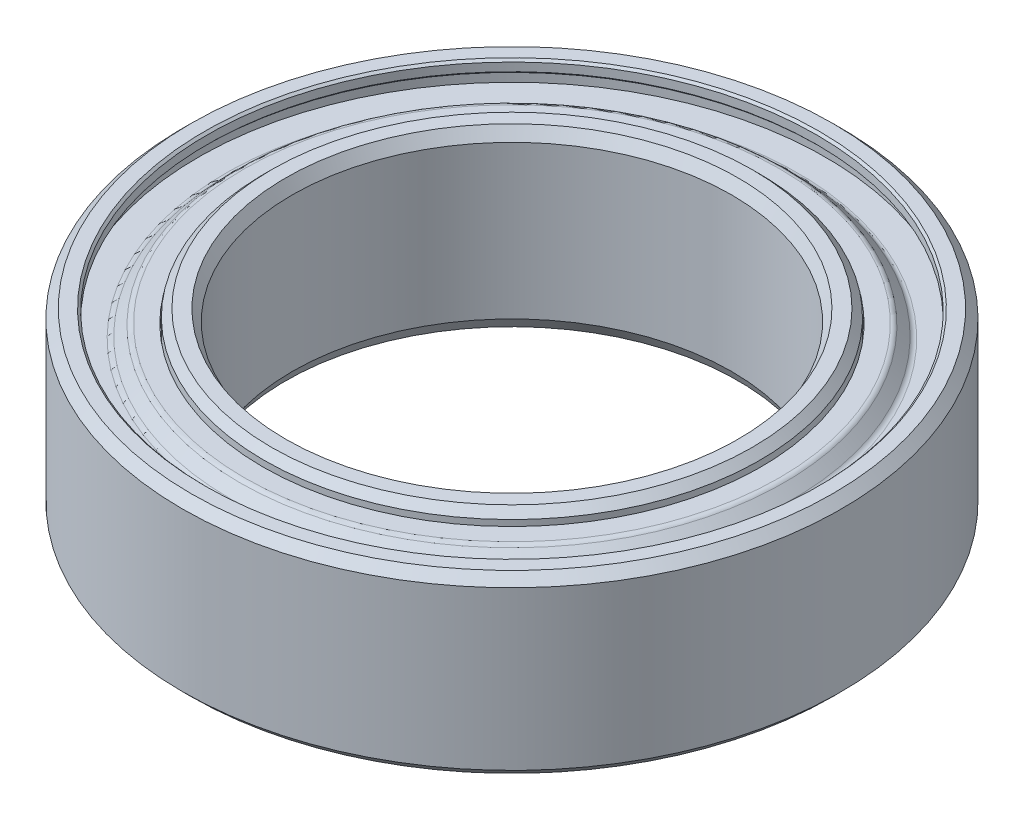
ISO-10303-21;
HEADER;
FILE_DESCRIPTION(('STEP AP214'),'2;1');
FILE_NAME('part.step','',(''),(''),'','','');
FILE_SCHEMA(('AUTOMOTIVE_DESIGN { 1 0 10303 214 1 1 1 1 }'));
ENDSEC;
DATA;
#1=APPLICATION_CONTEXT('core data for automotive mechanical design processes');
#2=APPLICATION_PROTOCOL_DEFINITION('international standard','automotive_design',2000,#1);
#3=PRODUCT_CONTEXT('',#1,'mechanical');
#4=PRODUCT('Part','Part','',(#3));
#5=PRODUCT_RELATED_PRODUCT_CATEGORY('part','',(#4));
#6=PRODUCT_DEFINITION_FORMATION('','',#4);
#7=PRODUCT_DEFINITION_CONTEXT('part definition',#1,'design');
#8=PRODUCT_DEFINITION('design','',#6,#7);
#9=PRODUCT_DEFINITION_SHAPE('','',#8);
#10=(LENGTH_UNIT() NAMED_UNIT(*) SI_UNIT(.MILLI.,.METRE.));
#11=(NAMED_UNIT(*) PLANE_ANGLE_UNIT() SI_UNIT($,.RADIAN.));
#12=(NAMED_UNIT(*) SI_UNIT($,.STERADIAN.) SOLID_ANGLE_UNIT());
#13=UNCERTAINTY_MEASURE_WITH_UNIT(LENGTH_MEASURE(1.E-05),#10,'distance_accuracy_value','');
#14=(GEOMETRIC_REPRESENTATION_CONTEXT(3) GLOBAL_UNCERTAINTY_ASSIGNED_CONTEXT((#13)) GLOBAL_UNIT_ASSIGNED_CONTEXT((#10,
#11,#12)) REPRESENTATION_CONTEXT('',''));
#15=CARTESIAN_POINT('',(0.,0.,0.));
#16=DIRECTION('',(0.,0.,1.));
#17=DIRECTION('',(1.,0.,0.));
#18=AXIS2_PLACEMENT_3D('',#15,#16,#17);
#19=CARTESIAN_POINT('',(0.,0.544,0.));
#20=DIRECTION('',(0.,-1.,0.));
#21=DIRECTION('',(0.,0.,-1.));
#22=AXIS2_PLACEMENT_3D('',#19,#20,#21);
#23=PLANE('',#22);
#24=CARTESIAN_POINT('',(0.,0.54400000001,0.));
#25=DIRECTION('',(0.,-1.,0.));
#26=DIRECTION('',(0.,0.,1.));
#27=AXIS2_PLACEMENT_3D('',#24,#25,#26);
#28=CIRCLE('',#27,5.6420187512442);
#29=CARTESIAN_POINT('',(0.,0.54400000001,5.6420187512442));
#30=VERTEX_POINT('',#29);
#31=EDGE_CURVE('E21',#30,#30,#28,.T.);
#32=ORIENTED_EDGE('',*,*,#31,.F.);
#33=EDGE_LOOP('',(#32));
#34=FACE_BOUND('',#33,.T.);
#35=CARTESIAN_POINT('',(0.,0.54400000001,0.));
#36=DIRECTION('',(0.,1.,0.));
#37=DIRECTION('',(0.,0.,1.));
#38=AXIS2_PLACEMENT_3D('',#35,#36,#37);
#39=CIRCLE('',#38,5.6670187512442);
#40=CARTESIAN_POINT('',(0.,0.54400000001,5.6670187512442));
#41=VERTEX_POINT('',#40);
#42=EDGE_CURVE('E232',#41,#41,#39,.T.);
#43=ORIENTED_EDGE('',*,*,#42,.F.);
#44=EDGE_LOOP('',(#43));
#45=FACE_BOUND('',#44,.T.);
#46=ADVANCED_FACE('F17',(#34,#45),#23,.T.);
#47=CARTESIAN_POINT('',(0.,3.456,0.));
#48=DIRECTION('',(0.,1.,0.));
#49=DIRECTION('',(1.,0.,0.));
#50=AXIS2_PLACEMENT_3D('',#47,#48,#49);
#51=PLANE('',#50);
#52=CARTESIAN_POINT('',(0.,3.45600000001,0.));
#53=DIRECTION('',(0.,-1.,0.));
#54=DIRECTION('',(0.,0.,1.));
#55=AXIS2_PLACEMENT_3D('',#52,#53,#54);
#56=CIRCLE('',#55,5.6420187512442);
#57=CARTESIAN_POINT('',(0.,3.45600000001,5.6420187512442));
#58=VERTEX_POINT('',#57);
#59=EDGE_CURVE('E11',#58,#58,#56,.T.);
#60=ORIENTED_EDGE('',*,*,#59,.T.);
#61=EDGE_LOOP('',(#60));
#62=FACE_BOUND('',#61,.T.);
#63=CARTESIAN_POINT('',(0.,3.45600000001,0.));
#64=DIRECTION('',(0.,1.,0.));
#65=DIRECTION('',(0.,0.,1.));
#66=AXIS2_PLACEMENT_3D('',#63,#64,#65);
#67=CIRCLE('',#66,5.6670187512442);
#68=CARTESIAN_POINT('',(0.,3.45600000001,5.6670187512442));
#69=VERTEX_POINT('',#68);
#70=EDGE_CURVE('E238',#69,#69,#67,.T.);
#71=ORIENTED_EDGE('',*,*,#70,.T.);
#72=EDGE_LOOP('',(#71));
#73=FACE_BOUND('',#72,.T.);
#74=ADVANCED_FACE('F357',(#62,#73),#51,.T.);
#75=CARTESIAN_POINT('',(0.,0.59,0.));
#76=DIRECTION('',(0.,-1.,0.));
#77=DIRECTION('',(0.,0.,-1.));
#78=AXIS2_PLACEMENT_3D('',#75,#76,#77);
#79=PLANE('',#78);
#80=CARTESIAN_POINT('',(0.,0.59000000001,0.));
#81=DIRECTION('',(0.,1.,0.));
#82=DIRECTION('',(0.,0.,-1.));
#83=AXIS2_PLACEMENT_3D('',#80,#81,#82);
#84=CIRCLE('',#83,6.50398570058625);
#85=CARTESIAN_POINT('',(0.,0.59000000001,-6.50398570058625));
#86=VERTEX_POINT('',#85);
#87=EDGE_CURVE('E254',#86,#86,#84,.T.);
#88=ORIENTED_EDGE('',*,*,#87,.T.);
#89=EDGE_LOOP('',(#88));
#90=FACE_BOUND('',#89,.T.);
#91=CARTESIAN_POINT('',(0.,0.59000000001,0.));
#92=DIRECTION('',(0.,1.,0.));
#93=DIRECTION('',(0.,0.,1.));
#94=AXIS2_PLACEMENT_3D('',#91,#92,#93);
#95=CIRCLE('',#94,7.1404926963171);
#96=CARTESIAN_POINT('',(0.,0.59000000001,7.1404926963171));
#97=VERTEX_POINT('',#96);
#98=EDGE_CURVE('E208',#97,#97,#95,.T.);
#99=ORIENTED_EDGE('',*,*,#98,.F.);
#100=EDGE_LOOP('',(#99));
#101=FACE_BOUND('',#100,.T.);
#102=ADVANCED_FACE('F19',(#90,#101),#79,.T.);
#103=CARTESIAN_POINT('',(0.,0.29,0.));
#104=DIRECTION('',(0.,-1.,0.));
#105=DIRECTION('',(0.,0.,-1.));
#106=AXIS2_PLACEMENT_3D('',#103,#104,#105);
#107=PLANE('',#106);
#108=CARTESIAN_POINT('',(0.,0.29000000001,0.));
#109=DIRECTION('',(0.,-1.,0.));
#110=DIRECTION('',(0.,0.,-1.));
#111=AXIS2_PLACEMENT_3D('',#108,#109,#110);
#112=CIRCLE('',#111,6.99049269631709);
#113=CARTESIAN_POINT('',(0.,0.29000000001,-6.99049269631709));
#114=VERTEX_POINT('',#113);
#115=EDGE_CURVE('E290',#114,#114,#112,.T.);
#116=ORIENTED_EDGE('',*,*,#115,.T.);
#117=EDGE_LOOP('',(#116));
#118=FACE_BOUND('',#117,.T.);
#119=CARTESIAN_POINT('',(0.,0.29000000001,0.));
#120=DIRECTION('',(0.,1.,0.));
#121=DIRECTION('',(0.,0.,1.));
#122=AXIS2_PLACEMENT_3D('',#119,#120,#121);
#123=CIRCLE('',#122,7.1404926963171);
#124=CARTESIAN_POINT('',(0.,0.29000000001,7.1404926963171));
#125=VERTEX_POINT('',#124);
#126=EDGE_CURVE('E205',#125,#125,#123,.T.);
#127=ORIENTED_EDGE('',*,*,#126,.T.);
#128=EDGE_LOOP('',(#127));
#129=FACE_BOUND('',#128,.T.);
#130=ADVANCED_FACE('F626',(#118,#129),#107,.F.);
#131=CARTESIAN_POINT('',(0.,3.41,0.));
#132=DIRECTION('',(0.,1.,0.));
#133=DIRECTION('',(1.,0.,0.));
#134=AXIS2_PLACEMENT_3D('',#131,#132,#133);
#135=PLANE('',#134);
#136=CARTESIAN_POINT('',(0.,3.41000000001,0.));
#137=DIRECTION('',(0.,-1.,0.));
#138=DIRECTION('',(0.,0.,1.));
#139=AXIS2_PLACEMENT_3D('',#136,#137,#138);
#140=CIRCLE('',#139,6.51398570058624);
#141=CARTESIAN_POINT('',(0.,3.41000000001,6.51398570058624));
#142=VERTEX_POINT('',#141);
#143=EDGE_CURVE('E241',#142,#142,#140,.T.);
#144=ORIENTED_EDGE('',*,*,#143,.T.);
#145=EDGE_LOOP('',(#144));
#146=FACE_BOUND('',#145,.T.);
#147=CARTESIAN_POINT('',(0.,3.41000000001,0.));
#148=DIRECTION('',(0.,1.,0.));
#149=DIRECTION('',(0.,0.,1.));
#150=AXIS2_PLACEMENT_3D('',#147,#148,#149);
#151=CIRCLE('',#150,7.1404926963171);
#152=CARTESIAN_POINT('',(0.,3.41000000001,7.1404926963171));
#153=VERTEX_POINT('',#152);
#154=EDGE_CURVE('E259',#153,#153,#151,.T.);
#155=ORIENTED_EDGE('',*,*,#154,.T.);
#156=EDGE_LOOP('',(#155));
#157=FACE_BOUND('',#156,.T.);
#158=ADVANCED_FACE('F614',(#146,#157),#135,.T.);
#159=CARTESIAN_POINT('',(0.,3.71,0.));
#160=DIRECTION('',(0.,1.,0.));
#161=DIRECTION('',(1.,0.,0.));
#162=AXIS2_PLACEMENT_3D('',#159,#160,#161);
#163=PLANE('',#162);
#164=CARTESIAN_POINT('',(0.,3.71000000001,0.));
#165=DIRECTION('',(0.,1.,0.));
#166=DIRECTION('',(0.,0.,1.));
#167=AXIS2_PLACEMENT_3D('',#164,#165,#166);
#168=CIRCLE('',#167,6.99049269631709);
#169=CARTESIAN_POINT('',(0.,3.71000000001,6.99049269631709));
#170=VERTEX_POINT('',#169);
#171=EDGE_CURVE('E279',#170,#170,#168,.T.);
#172=ORIENTED_EDGE('',*,*,#171,.T.);
#173=EDGE_LOOP('',(#172));
#174=FACE_BOUND('',#173,.T.);
#175=CARTESIAN_POINT('',(0.,3.71000000001,0.));
#176=DIRECTION('',(0.,1.,0.));
#177=DIRECTION('',(0.,0.,1.));
#178=AXIS2_PLACEMENT_3D('',#175,#176,#177);
#179=CIRCLE('',#178,7.1404926963171);
#180=CARTESIAN_POINT('',(0.,3.71000000001,7.1404926963171));
#181=VERTEX_POINT('',#180);
#182=EDGE_CURVE('E229',#181,#181,#179,.T.);
#183=ORIENTED_EDGE('',*,*,#182,.F.);
#184=EDGE_LOOP('',(#183));
#185=FACE_BOUND('',#184,.T.);
#186=ADVANCED_FACE('F327',(#174,#185),#163,.F.);
#187=CARTESIAN_POINT('',(0.,0.,0.));
#188=DIRECTION('',(0.,1.,0.));
#189=DIRECTION('',(1.,0.,0.));
#190=AXIS2_PLACEMENT_3D('',#187,#188,#189);
#191=PLANE('',#190);
#192=CARTESIAN_POINT('',(0.,0.,0.));
#193=DIRECTION('',(0.,1.,0.));
#194=DIRECTION('',(0.,0.,1.));
#195=AXIS2_PLACEMENT_3D('',#192,#193,#194);
#196=CIRCLE('',#195,6.99049269631709);
#197=CARTESIAN_POINT('',(0.,0.,6.99049269631709));
#198=VERTEX_POINT('',#197);
#199=EDGE_CURVE('E299',#198,#198,#196,.T.);
#200=ORIENTED_EDGE('',*,*,#199,.T.);
#201=EDGE_LOOP('',(#200));
#202=FACE_BOUND('',#201,.T.);
#203=CARTESIAN_POINT('',(0.,0.,0.));
#204=DIRECTION('',(0.,-1.,0.));
#205=DIRECTION('',(0.,0.,1.));
#206=AXIS2_PLACEMENT_3D('',#203,#204,#205);
#207=CIRCLE('',#206,7.30000000001);
#208=CARTESIAN_POINT('',(0.,0.,7.30000000001));
#209=VERTEX_POINT('',#208);
#210=EDGE_CURVE('E296',#209,#209,#207,.T.);
#211=ORIENTED_EDGE('',*,*,#210,.T.);
#212=EDGE_LOOP('',(#211));
#213=FACE_BOUND('',#212,.T.);
#214=ADVANCED_FACE('F323',(#202,#213),#191,.F.);
#215=CARTESIAN_POINT('',(0.,4.,0.));
#216=DIRECTION('',(0.,1.,0.));
#217=DIRECTION('',(1.,0.,0.));
#218=AXIS2_PLACEMENT_3D('',#215,#216,#217);
#219=PLANE('',#218);
#220=CARTESIAN_POINT('',(0.,4.00000000001,0.));
#221=DIRECTION('',(0.,-1.,0.));
#222=DIRECTION('',(0.,0.,1.));
#223=AXIS2_PLACEMENT_3D('',#220,#221,#222);
#224=CIRCLE('',#223,5.15000000001);
#225=CARTESIAN_POINT('',(0.,4.00000000001,5.15000000001));
#226=VERTEX_POINT('',#225);
#227=EDGE_CURVE('E220',#226,#226,#224,.T.);
#228=ORIENTED_EDGE('',*,*,#227,.T.);
#229=EDGE_LOOP('',(#228));
#230=FACE_BOUND('',#229,.T.);
#231=CARTESIAN_POINT('',(0.,4.00000000001,0.));
#232=DIRECTION('',(0.,1.,0.));
#233=DIRECTION('',(0.,0.,1.));
#234=AXIS2_PLACEMENT_3D('',#231,#232,#233);
#235=CIRCLE('',#234,5.4720187512442);
#236=CARTESIAN_POINT('',(0.,4.00000000001,5.4720187512442));
#237=VERTEX_POINT('',#236);
#238=EDGE_CURVE('E193',#237,#237,#235,.T.);
#239=ORIENTED_EDGE('',*,*,#238,.T.);
#240=EDGE_LOOP('',(#239));
#241=FACE_BOUND('',#240,.T.);
#242=ADVANCED_FACE('F326',(#230,#241),#219,.T.);
#243=CARTESIAN_POINT('',(0.,0.,0.));
#244=DIRECTION('',(0.,1.,0.));
#245=DIRECTION('',(1.,0.,0.));
#246=AXIS2_PLACEMENT_3D('',#243,#244,#245);
#247=PLANE('',#246);
#248=CARTESIAN_POINT('',(0.,0.,0.));
#249=DIRECTION('',(0.,1.,0.));
#250=DIRECTION('',(0.,0.,1.));
#251=AXIS2_PLACEMENT_3D('',#248,#249,#250);
#252=CIRCLE('',#251,5.15000000001);
#253=CARTESIAN_POINT('',(0.,0.,5.15000000001));
#254=VERTEX_POINT('',#253);
#255=EDGE_CURVE('E200',#254,#254,#252,.T.);
#256=ORIENTED_EDGE('',*,*,#255,.T.);
#257=EDGE_LOOP('',(#256));
#258=FACE_BOUND('',#257,.T.);
#259=CARTESIAN_POINT('',(0.,0.,0.));
#260=DIRECTION('',(0.,-1.,0.));
#261=DIRECTION('',(0.,0.,1.));
#262=AXIS2_PLACEMENT_3D('',#259,#260,#261);
#263=CIRCLE('',#262,5.4720187512442);
#264=CARTESIAN_POINT('',(0.,0.,5.4720187512442));
#265=VERTEX_POINT('',#264);
#266=EDGE_CURVE('E192',#265,#265,#263,.T.);
#267=ORIENTED_EDGE('',*,*,#266,.T.);
#268=EDGE_LOOP('',(#267));
#269=FACE_BOUND('',#268,.T.);
#270=ADVANCED_FACE('F415',(#258,#269),#247,.F.);
#271=CARTESIAN_POINT('',(0.,3.71,0.));
#272=DIRECTION('',(0.,1.,0.));
#273=DIRECTION('',(1.,0.,0.));
#274=AXIS2_PLACEMENT_3D('',#271,#272,#273);
#275=PLANE('',#274);
#276=CARTESIAN_POINT('',(0.,3.71000000001,0.));
#277=DIRECTION('',(0.,1.,0.));
#278=DIRECTION('',(0.,0.,1.));
#279=AXIS2_PLACEMENT_3D('',#276,#277,#278);
#280=CIRCLE('',#279,5.6670187512442);
#281=CARTESIAN_POINT('',(0.,3.71000000001,5.6670187512442));
#282=VERTEX_POINT('',#281);
#283=EDGE_CURVE('E235',#282,#282,#280,.T.);
#284=ORIENTED_EDGE('',*,*,#283,.F.);
#285=EDGE_LOOP('',(#284));
#286=FACE_BOUND('',#285,.T.);
#287=CARTESIAN_POINT('',(0.,3.71000000001,0.));
#288=DIRECTION('',(0.,1.,0.));
#289=DIRECTION('',(0.,0.,1.));
#290=AXIS2_PLACEMENT_3D('',#287,#288,#289);
#291=CIRCLE('',#290,6.08972163187431);
#292=CARTESIAN_POINT('',(0.,3.71000000001,6.08972163187431));
#293=VERTEX_POINT('',#292);
#294=EDGE_CURVE('E210',#293,#293,#291,.T.);
#295=ORIENTED_EDGE('',*,*,#294,.T.);
#296=EDGE_LOOP('',(#295));
#297=FACE_BOUND('',#296,.T.);
#298=ADVANCED_FACE('F373',(#286,#297),#275,.T.);
#299=CARTESIAN_POINT('',(0.,0.3,0.));
#300=DIRECTION('',(0.,-1.,0.));
#301=DIRECTION('',(0.,0.,-1.));
#302=AXIS2_PLACEMENT_3D('',#299,#300,#301);
#303=PLANE('',#302);
#304=CARTESIAN_POINT('',(0.,0.30000000001,0.));
#305=DIRECTION('',(0.,1.,0.));
#306=DIRECTION('',(0.,0.,-1.));
#307=AXIS2_PLACEMENT_3D('',#304,#305,#306);
#308=CIRCLE('',#307,5.6670187512442);
#309=CARTESIAN_POINT('',(0.,0.30000000001,-5.6670187512442));
#310=VERTEX_POINT('',#309);
#311=EDGE_CURVE('E226',#310,#310,#308,.T.);
#312=ORIENTED_EDGE('',*,*,#311,.T.);
#313=EDGE_LOOP('',(#312));
#314=FACE_BOUND('',#313,.T.);
#315=CARTESIAN_POINT('',(0.,0.30000000001,0.));
#316=DIRECTION('',(0.,-1.,0.));
#317=DIRECTION('',(0.,0.,-1.));
#318=AXIS2_PLACEMENT_3D('',#315,#316,#317);
#319=CIRCLE('',#318,6.08972163187432);
#320=CARTESIAN_POINT('',(0.,0.30000000001,-6.08972163187432));
#321=VERTEX_POINT('',#320);
#322=EDGE_CURVE('E246',#321,#321,#319,.T.);
#323=ORIENTED_EDGE('',*,*,#322,.T.);
#324=EDGE_LOOP('',(#323));
#325=FACE_BOUND('',#324,.T.);
#326=ADVANCED_FACE('F352',(#314,#325),#303,.T.);
#327=CARTESIAN_POINT('',(0.,4.,0.));
#328=DIRECTION('',(0.,1.,0.));
#329=DIRECTION('',(1.,0.,0.));
#330=AXIS2_PLACEMENT_3D('',#327,#328,#329);
#331=PLANE('',#330);
#332=CARTESIAN_POINT('',(0.,4.00000000001,0.));
#333=DIRECTION('',(0.,-1.,0.));
#334=DIRECTION('',(0.,0.,1.));
#335=AXIS2_PLACEMENT_3D('',#332,#333,#334);
#336=CIRCLE('',#335,6.99049269631709);
#337=CARTESIAN_POINT('',(0.,4.00000000001,6.99049269631709));
#338=VERTEX_POINT('',#337);
#339=EDGE_CURVE('E280',#338,#338,#336,.T.);
#340=ORIENTED_EDGE('',*,*,#339,.T.);
#341=EDGE_LOOP('',(#340));
#342=FACE_BOUND('',#341,.T.);
#343=CARTESIAN_POINT('',(0.,4.00000000001,0.));
#344=DIRECTION('',(0.,1.,0.));
#345=DIRECTION('',(0.,0.,1.));
#346=AXIS2_PLACEMENT_3D('',#343,#344,#345);
#347=CIRCLE('',#346,7.30000000001);
#348=CARTESIAN_POINT('',(0.,4.00000000001,7.30000000001));
#349=VERTEX_POINT('',#348);
#350=EDGE_CURVE('E274',#349,#349,#347,.T.);
#351=ORIENTED_EDGE('',*,*,#350,.T.);
#352=EDGE_LOOP('',(#351));
#353=FACE_BOUND('',#352,.T.);
#354=ADVANCED_FACE('F340',(#342,#353),#331,.T.);
#355=CARTESIAN_POINT('',(0.,3.05,0.));
#356=DIRECTION('',(0.,-1.,0.));
#357=DIRECTION('',(0.,0.,-1.));
#358=AXIS2_PLACEMENT_3D('',#355,#356,#357);
#359=CYLINDRICAL_SURFACE('',#358,7.5);
#360=CARTESIAN_POINT('',(0.,3.80000000001,0.));
#361=DIRECTION('',(0.,-1.,0.));
#362=DIRECTION('',(0.,0.,1.));
#363=AXIS2_PLACEMENT_3D('',#360,#361,#362);
#364=CIRCLE('',#363,7.50000000001);
#365=CARTESIAN_POINT('',(0.,3.80000000001,7.50000000001));
#366=VERTEX_POINT('',#365);
#367=EDGE_CURVE('E272',#366,#366,#364,.T.);
#368=ORIENTED_EDGE('',*,*,#367,.T.);
#369=EDGE_LOOP('',(#368));
#370=FACE_BOUND('',#369,.T.);
#371=CARTESIAN_POINT('',(0.,0.200000000009995,0.));
#372=DIRECTION('',(0.,1.,0.));
#373=DIRECTION('',(0.,0.,1.));
#374=AXIS2_PLACEMENT_3D('',#371,#372,#373);
#375=CIRCLE('',#374,7.50000000001);
#376=CARTESIAN_POINT('',(0.,0.200000000009995,7.50000000001));
#377=VERTEX_POINT('',#376);
#378=EDGE_CURVE('E300',#377,#377,#375,.T.);
#379=ORIENTED_EDGE('',*,*,#378,.T.);
#380=EDGE_LOOP('',(#379));
#381=FACE_BOUND('',#380,.T.);
#382=ADVANCED_FACE('F337',(#370,#381),#359,.T.);
#383=CARTESIAN_POINT('',(0.,0.,0.));
#384=DIRECTION('',(0.,1.,0.));
#385=DIRECTION('',(0.,0.,1.));
#386=AXIS2_PLACEMENT_3D('',#383,#384,#385);
#387=CYLINDRICAL_SURFACE('',#386,5.);
#388=CARTESIAN_POINT('',(0.,0.259807621145335,0.));
#389=DIRECTION('',(0.,-1.,0.));
#390=DIRECTION('',(0.,0.,1.));
#391=AXIS2_PLACEMENT_3D('',#388,#389,#390);
#392=CIRCLE('',#391,5.00000000001);
#393=CARTESIAN_POINT('',(0.,0.259807621145335,5.00000000001));
#394=VERTEX_POINT('',#393);
#395=EDGE_CURVE('E217',#394,#394,#392,.T.);
#396=ORIENTED_EDGE('',*,*,#395,.T.);
#397=EDGE_LOOP('',(#396));
#398=FACE_BOUND('',#397,.T.);
#399=CARTESIAN_POINT('',(0.,3.74019237887467,0.));
#400=DIRECTION('',(0.,1.,0.));
#401=DIRECTION('',(0.,0.,1.));
#402=AXIS2_PLACEMENT_3D('',#399,#400,#401);
#403=CIRCLE('',#402,5.00000000001);
#404=CARTESIAN_POINT('',(0.,3.74019237887467,5.00000000001));
#405=VERTEX_POINT('',#404);
#406=EDGE_CURVE('E223',#405,#405,#403,.T.);
#407=ORIENTED_EDGE('',*,*,#406,.T.);
#408=EDGE_LOOP('',(#407));
#409=FACE_BOUND('',#408,.T.);
#410=ADVANCED_FACE('F339',(#398,#409),#387,.F.);
#411=CARTESIAN_POINT('',(0.,3.71,0.));
#412=DIRECTION('',(0.,1.,0.));
#413=DIRECTION('',(0.,0.,1.));
#414=AXIS2_PLACEMENT_3D('',#411,#412,#413);
#415=CYLINDRICAL_SURFACE('',#414,6.94049269630709);
#416=CARTESIAN_POINT('',(0.,3.76000000001,0.));
#417=DIRECTION('',(0.,-1.,0.));
#418=DIRECTION('',(0.,0.,1.));
#419=AXIS2_PLACEMENT_3D('',#416,#417,#418);
#420=CIRCLE('',#419,6.94049269631709);
#421=CARTESIAN_POINT('',(0.,3.76000000001,6.94049269631709));
#422=VERTEX_POINT('',#421);
#423=EDGE_CURVE('E287',#422,#422,#420,.T.);
#424=ORIENTED_EDGE('',*,*,#423,.T.);
#425=EDGE_LOOP('',(#424));
#426=FACE_BOUND('',#425,.T.);
#427=CARTESIAN_POINT('',(0.,3.95000000001,0.));
#428=DIRECTION('',(0.,1.,0.));
#429=DIRECTION('',(0.,0.,1.));
#430=AXIS2_PLACEMENT_3D('',#427,#428,#429);
#431=CIRCLE('',#430,6.94049269631709);
#432=CARTESIAN_POINT('',(0.,3.95000000001,6.94049269631709));
#433=VERTEX_POINT('',#432);
#434=EDGE_CURVE('E276',#433,#433,#431,.T.);
#435=ORIENTED_EDGE('',*,*,#434,.T.);
#436=EDGE_LOOP('',(#435));
#437=FACE_BOUND('',#436,.T.);
#438=ADVANCED_FACE('F349',(#426,#437),#415,.F.);
#439=CARTESIAN_POINT('',(0.,3.71,0.));
#440=DIRECTION('',(0.,1.,0.));
#441=DIRECTION('',(0.,0.,1.));
#442=AXIS2_PLACEMENT_3D('',#439,#440,#441);
#443=CYLINDRICAL_SURFACE('',#442,5.6420187512342);
#444=ORIENTED_EDGE('',*,*,#59,.F.);
#445=EDGE_LOOP('',(#444));
#446=FACE_BOUND('',#445,.T.);
#447=CARTESIAN_POINT('',(0.,3.83000000001,0.));
#448=DIRECTION('',(0.,-1.,0.));
#449=DIRECTION('',(0.,0.,1.));
#450=AXIS2_PLACEMENT_3D('',#447,#448,#449);
#451=CIRCLE('',#450,5.6420187512442);
#452=CARTESIAN_POINT('',(0.,3.83000000001,5.6420187512442));
#453=VERTEX_POINT('',#452);
#454=EDGE_CURVE('E202',#453,#453,#451,.T.);
#455=ORIENTED_EDGE('',*,*,#454,.T.);
#456=EDGE_LOOP('',(#455));
#457=FACE_BOUND('',#456,.T.);
#458=ADVANCED_FACE('F422',(#446,#457),#443,.T.);
#459=CARTESIAN_POINT('',(0.,0.3,0.));
#460=DIRECTION('',(0.,-1.,0.));
#461=DIRECTION('',(0.,0.,-1.));
#462=AXIS2_PLACEMENT_3D('',#459,#460,#461);
#463=CYLINDRICAL_SURFACE('',#462,6.94049269630709);
#464=CARTESIAN_POINT('',(0.,0.240000000010004,0.));
#465=DIRECTION('',(0.,1.,0.));
#466=DIRECTION('',(0.,0.,-1.));
#467=AXIS2_PLACEMENT_3D('',#464,#465,#466);
#468=CIRCLE('',#467,6.94049269631709);
#469=CARTESIAN_POINT('',(0.,0.240000000010004,-6.94049269631709));
#470=VERTEX_POINT('',#469);
#471=EDGE_CURVE('E293',#470,#470,#468,.T.);
#472=ORIENTED_EDGE('',*,*,#471,.T.);
#473=EDGE_LOOP('',(#472));
#474=FACE_BOUND('',#473,.T.);
#475=CARTESIAN_POINT('',(0.,0.0500000000099919,0.));
#476=DIRECTION('',(0.,-1.,0.));
#477=DIRECTION('',(0.,0.,1.));
#478=AXIS2_PLACEMENT_3D('',#475,#476,#477);
#479=CIRCLE('',#478,6.94049269631709);
#480=CARTESIAN_POINT('',(0.,0.0500000000099919,6.94049269631709));
#481=VERTEX_POINT('',#480);
#482=EDGE_CURVE('E303',#481,#481,#479,.T.);
#483=ORIENTED_EDGE('',*,*,#482,.T.);
#484=EDGE_LOOP('',(#483));
#485=FACE_BOUND('',#484,.T.);
#486=ADVANCED_FACE('F313',(#474,#485),#463,.F.);
#487=CARTESIAN_POINT('',(0.,0.3,0.));
#488=DIRECTION('',(0.,-1.,0.));
#489=DIRECTION('',(0.,0.,-1.));
#490=AXIS2_PLACEMENT_3D('',#487,#488,#489);
#491=CYLINDRICAL_SURFACE('',#490,5.6420187512342);
#492=ORIENTED_EDGE('',*,*,#31,.T.);
#493=EDGE_LOOP('',(#492));
#494=FACE_BOUND('',#493,.T.);
#495=CARTESIAN_POINT('',(0.,0.170000000009999,0.));
#496=DIRECTION('',(0.,1.,0.));
#497=DIRECTION('',(0.,0.,1.));
#498=AXIS2_PLACEMENT_3D('',#495,#496,#497);
#499=CIRCLE('',#498,5.6420187512442);
#500=CARTESIAN_POINT('',(0.,0.170000000009999,5.6420187512442));
#501=VERTEX_POINT('',#500);
#502=EDGE_CURVE('E188',#501,#501,#499,.T.);
#503=ORIENTED_EDGE('',*,*,#502,.T.);
#504=EDGE_LOOP('',(#503));
#505=FACE_BOUND('',#504,.T.);
#506=ADVANCED_FACE('F189',(#494,#505),#491,.T.);
#507=CARTESIAN_POINT('',(0.,3.41,0.));
#508=DIRECTION('',(0.,1.,0.));
#509=DIRECTION('',(0.,0.,1.));
#510=AXIS2_PLACEMENT_3D('',#507,#508,#509);
#511=CYLINDRICAL_SURFACE('',#510,7.1404926963071);
#512=ORIENTED_EDGE('',*,*,#154,.F.);
#513=EDGE_LOOP('',(#512));
#514=FACE_BOUND('',#513,.T.);
#515=ORIENTED_EDGE('',*,*,#182,.T.);
#516=EDGE_LOOP('',(#515));
#517=FACE_BOUND('',#516,.T.);
#518=ADVANCED_FACE('F426',(#514,#517),#511,.F.);
#519=CARTESIAN_POINT('',(0.,0.59,0.));
#520=DIRECTION('',(0.,-1.,0.));
#521=DIRECTION('',(0.,0.,-1.));
#522=AXIS2_PLACEMENT_3D('',#519,#520,#521);
#523=CYLINDRICAL_SURFACE('',#522,7.1404926963071);
#524=ORIENTED_EDGE('',*,*,#98,.T.);
#525=EDGE_LOOP('',(#524));
#526=FACE_BOUND('',#525,.T.);
#527=ORIENTED_EDGE('',*,*,#126,.F.);
#528=EDGE_LOOP('',(#527));
#529=FACE_BOUND('',#528,.T.);
#530=ADVANCED_FACE('F408',(#526,#529),#523,.F.);
#531=CARTESIAN_POINT('',(0.,0.6,0.));
#532=DIRECTION('',(0.,1.,0.));
#533=DIRECTION('',(0.,0.,1.));
#534=AXIS2_PLACEMENT_3D('',#531,#532,#533);
#535=CONICAL_SURFACE('',#534,6.45185366622029,0.785398163397442);
#536=CARTESIAN_POINT('',(0.,0.343933982832018,0.));
#537=DIRECTION('',(0.,1.,0.));
#538=DIRECTION('',(0.,0.,-1.));
#539=AXIS2_PLACEMENT_3D('',#536,#537,#538);
#540=CIRCLE('',#539,6.1957876490523);
#541=CARTESIAN_POINT('',(0.,0.343933982832018,-6.1957876490523));
#542=VERTEX_POINT('',#541);
#543=EDGE_CURVE('E249',#542,#542,#540,.T.);
#544=ORIENTED_EDGE('',*,*,#543,.T.);
#545=EDGE_LOOP('',(#544));
#546=FACE_BOUND('',#545,.T.);
#547=CARTESIAN_POINT('',(0.,0.546066017187981,0.));
#548=DIRECTION('',(0.,-1.,0.));
#549=DIRECTION('',(0.,0.,1.));
#550=AXIS2_PLACEMENT_3D('',#547,#548,#549);
#551=CIRCLE('',#550,6.39791968340826);
#552=CARTESIAN_POINT('',(0.,0.546066017187981,6.39791968340826));
#553=VERTEX_POINT('',#552);
#554=EDGE_CURVE('E209',#553,#553,#551,.T.);
#555=ORIENTED_EDGE('',*,*,#554,.T.);
#556=EDGE_LOOP('',(#555));
#557=FACE_BOUND('',#556,.T.);
#558=ADVANCED_FACE('F405',(#546,#557),#535,.T.);
#559=CARTESIAN_POINT('',(0.,3.71,0.));
#560=DIRECTION('',(0.,-1.,0.));
#561=DIRECTION('',(0.,0.,-1.));
#562=AXIS2_PLACEMENT_3D('',#559,#560,#561);
#563=CONICAL_SURFACE('',#562,6.15185366622028,0.785398163397448);
#564=CARTESIAN_POINT('',(0.,3.66606601718798,0.));
#565=DIRECTION('',(0.,-1.,0.));
#566=DIRECTION('',(0.,0.,1.));
#567=AXIS2_PLACEMENT_3D('',#564,#565,#566);
#568=CIRCLE('',#567,6.19578764905229);
#569=CARTESIAN_POINT('',(0.,3.66606601718798,6.19578764905229));
#570=VERTEX_POINT('',#569);
#571=EDGE_CURVE('E213',#570,#570,#568,.T.);
#572=ORIENTED_EDGE('',*,*,#571,.T.);
#573=EDGE_LOOP('',(#572));
#574=FACE_BOUND('',#573,.T.);
#575=CARTESIAN_POINT('',(0.,3.45393398283202,0.));
#576=DIRECTION('',(0.,1.,0.));
#577=DIRECTION('',(0.,0.,-1.));
#578=AXIS2_PLACEMENT_3D('',#575,#576,#577);
#579=CIRCLE('',#578,6.40791968340826);
#580=CARTESIAN_POINT('',(0.,3.45393398283202,-6.40791968340826));
#581=VERTEX_POINT('',#580);
#582=EDGE_CURVE('E214',#581,#581,#579,.T.);
#583=ORIENTED_EDGE('',*,*,#582,.T.);
#584=EDGE_LOOP('',(#583));
#585=FACE_BOUND('',#584,.T.);
#586=ADVANCED_FACE('F392',(#574,#585),#563,.T.);
#587=CARTESIAN_POINT('',(0.,0.44,0.));
#588=DIRECTION('',(0.,-1.,0.));
#589=DIRECTION('',(0.,0.,-1.));
#590=AXIS2_PLACEMENT_3D('',#587,#588,#589);
#591=TOROIDAL_SURFACE('',#590,6.50398570057625,0.15);
#592=ORIENTED_EDGE('',*,*,#554,.F.);
#593=EDGE_LOOP('',(#592));
#594=FACE_BOUND('',#593,.T.);
#595=ORIENTED_EDGE('',*,*,#87,.F.);
#596=EDGE_LOOP('',(#595));
#597=FACE_BOUND('',#596,.T.);
#598=ADVANCED_FACE('F389',(#594,#597),#591,.F.);
#599=CARTESIAN_POINT('',(0.,0.45,0.));
#600=DIRECTION('',(0.,-1.,0.));
#601=DIRECTION('',(0.,0.,-1.));
#602=AXIS2_PLACEMENT_3D('',#599,#600,#601);
#603=TOROIDAL_SURFACE('',#602,6.08972163186432,0.15);
#604=ORIENTED_EDGE('',*,*,#543,.F.);
#605=EDGE_LOOP('',(#604));
#606=FACE_BOUND('',#605,.T.);
#607=ORIENTED_EDGE('',*,*,#322,.F.);
#608=EDGE_LOOP('',(#607));
#609=FACE_BOUND('',#608,.T.);
#610=ADVANCED_FACE('F378',(#606,#609),#603,.T.);
#611=CARTESIAN_POINT('',(0.,3.56,0.));
#612=DIRECTION('',(0.,1.,0.));
#613=DIRECTION('',(0.,0.,1.));
#614=AXIS2_PLACEMENT_3D('',#611,#612,#613);
#615=TOROIDAL_SURFACE('',#614,6.08972163186431,0.15);
#616=ORIENTED_EDGE('',*,*,#571,.F.);
#617=EDGE_LOOP('',(#616));
#618=FACE_BOUND('',#617,.T.);
#619=ORIENTED_EDGE('',*,*,#294,.F.);
#620=EDGE_LOOP('',(#619));
#621=FACE_BOUND('',#620,.T.);
#622=ADVANCED_FACE('F375',(#618,#621),#615,.T.);
#623=CARTESIAN_POINT('',(0.,3.56,0.));
#624=DIRECTION('',(0.,1.,0.));
#625=DIRECTION('',(0.,0.,1.));
#626=AXIS2_PLACEMENT_3D('',#623,#624,#625);
#627=TOROIDAL_SURFACE('',#626,6.51398570057624,0.15);
#628=ORIENTED_EDGE('',*,*,#582,.F.);
#629=EDGE_LOOP('',(#628));
#630=FACE_BOUND('',#629,.T.);
#631=ORIENTED_EDGE('',*,*,#143,.F.);
#632=EDGE_LOOP('',(#631));
#633=FACE_BOUND('',#632,.T.);
#634=ADVANCED_FACE('F377',(#630,#633),#627,.F.);
#635=CARTESIAN_POINT('',(0.,3.456,0.));
#636=DIRECTION('',(0.,1.,0.));
#637=DIRECTION('',(0.,0.,1.));
#638=AXIS2_PLACEMENT_3D('',#635,#636,#637);
#639=CYLINDRICAL_SURFACE('',#638,5.6670187512342);
#640=ORIENTED_EDGE('',*,*,#70,.F.);
#641=EDGE_LOOP('',(#640));
#642=FACE_BOUND('',#641,.T.);
#643=ORIENTED_EDGE('',*,*,#283,.T.);
#644=EDGE_LOOP('',(#643));
#645=FACE_BOUND('',#644,.T.);
#646=ADVANCED_FACE('F397',(#642,#645),#639,.F.);
#647=CARTESIAN_POINT('',(0.,0.544,0.));
#648=DIRECTION('',(0.,-1.,0.));
#649=DIRECTION('',(0.,0.,-1.));
#650=AXIS2_PLACEMENT_3D('',#647,#648,#649);
#651=CYLINDRICAL_SURFACE('',#650,5.6670187512342);
#652=ORIENTED_EDGE('',*,*,#42,.T.);
#653=EDGE_LOOP('',(#652));
#654=FACE_BOUND('',#653,.T.);
#655=ORIENTED_EDGE('',*,*,#311,.F.);
#656=EDGE_LOOP('',(#655));
#657=FACE_BOUND('',#656,.T.);
#658=ADVANCED_FACE('F394',(#654,#657),#651,.F.);
#659=CARTESIAN_POINT('',(0.,3.74019237886467,0.));
#660=DIRECTION('',(0.,1.,0.));
#661=DIRECTION('',(0.,0.,1.));
#662=AXIS2_PLACEMENT_3D('',#659,#660,#661);
#663=CONICAL_SURFACE('',#662,5.,0.523598775598299);
#664=ORIENTED_EDGE('',*,*,#406,.F.);
#665=EDGE_LOOP('',(#664));
#666=FACE_BOUND('',#665,.T.);
#667=ORIENTED_EDGE('',*,*,#227,.F.);
#668=EDGE_LOOP('',(#667));
#669=FACE_BOUND('',#668,.T.);
#670=ADVANCED_FACE('F387',(#666,#669),#663,.F.);
#671=CARTESIAN_POINT('',(0.,0.,0.));
#672=DIRECTION('',(0.,-1.,0.));
#673=DIRECTION('',(0.,0.,-1.));
#674=AXIS2_PLACEMENT_3D('',#671,#672,#673);
#675=CONICAL_SURFACE('',#674,5.15,0.523598775598299);
#676=ORIENTED_EDGE('',*,*,#395,.F.);
#677=EDGE_LOOP('',(#676));
#678=FACE_BOUND('',#677,.T.);
#679=ORIENTED_EDGE('',*,*,#255,.F.);
#680=EDGE_LOOP('',(#679));
#681=FACE_BOUND('',#680,.T.);
#682=ADVANCED_FACE('F383',(#678,#681),#675,.F.);
#683=CARTESIAN_POINT('',(0.,0.,0.));
#684=DIRECTION('',(0.,1.,0.));
#685=DIRECTION('',(0.,0.,1.));
#686=AXIS2_PLACEMENT_3D('',#683,#684,#685);
#687=CONICAL_SURFACE('',#686,5.4720187512342,0.785398163397453);
#688=ORIENTED_EDGE('',*,*,#266,.F.);
#689=EDGE_LOOP('',(#688));
#690=FACE_BOUND('',#689,.T.);
#691=ORIENTED_EDGE('',*,*,#502,.F.);
#692=EDGE_LOOP('',(#691));
#693=FACE_BOUND('',#692,.T.);
#694=ADVANCED_FACE('F369',(#690,#693),#687,.T.);
#695=CARTESIAN_POINT('',(0.,4.,0.));
#696=DIRECTION('',(0.,-1.,0.));
#697=DIRECTION('',(0.,0.,-1.));
#698=AXIS2_PLACEMENT_3D('',#695,#696,#697);
#699=CONICAL_SURFACE('',#698,5.4720187512342,0.785398163397453);
#700=ORIENTED_EDGE('',*,*,#238,.F.);
#701=EDGE_LOOP('',(#700));
#702=FACE_BOUND('',#701,.T.);
#703=ORIENTED_EDGE('',*,*,#454,.F.);
#704=EDGE_LOOP('',(#703));
#705=FACE_BOUND('',#704,.T.);
#706=ADVANCED_FACE('F333',(#702,#705),#699,.T.);
#707=CARTESIAN_POINT('',(0.,0.199999999999995,0.));
#708=DIRECTION('',(0.,1.,0.));
#709=DIRECTION('',(0.,0.,1.));
#710=AXIS2_PLACEMENT_3D('',#707,#708,#709);
#711=CONICAL_SURFACE('',#710,7.5,0.785398163397452);
#712=ORIENTED_EDGE('',*,*,#210,.F.);
#713=EDGE_LOOP('',(#712));
#714=FACE_BOUND('',#713,.T.);
#715=ORIENTED_EDGE('',*,*,#378,.F.);
#716=EDGE_LOOP('',(#715));
#717=FACE_BOUND('',#716,.T.);
#718=ADVANCED_FACE('F319',(#714,#717),#711,.T.);
#719=CARTESIAN_POINT('',(0.,0.0499999999999919,0.));
#720=DIRECTION('',(0.,-1.,0.));
#721=DIRECTION('',(0.,0.,-1.));
#722=AXIS2_PLACEMENT_3D('',#719,#720,#721);
#723=CONICAL_SURFACE('',#722,6.94049269630709,0.785398163397483);
#724=ORIENTED_EDGE('',*,*,#482,.F.);
#725=EDGE_LOOP('',(#724));
#726=FACE_BOUND('',#725,.T.);
#727=ORIENTED_EDGE('',*,*,#199,.F.);
#728=EDGE_LOOP('',(#727));
#729=FACE_BOUND('',#728,.T.);
#730=ADVANCED_FACE('F315',(#726,#729),#723,.F.);
#731=CARTESIAN_POINT('',(0.,0.240000000000004,0.));
#732=DIRECTION('',(0.,1.,0.));
#733=DIRECTION('',(0.,0.,1.));
#734=AXIS2_PLACEMENT_3D('',#731,#732,#733);
#735=CONICAL_SURFACE('',#734,6.94049269630709,0.785398163397405);
#736=ORIENTED_EDGE('',*,*,#471,.F.);
#737=EDGE_LOOP('',(#736));
#738=FACE_BOUND('',#737,.T.);
#739=ORIENTED_EDGE('',*,*,#115,.F.);
#740=EDGE_LOOP('',(#739));
#741=FACE_BOUND('',#740,.T.);
#742=ADVANCED_FACE('F318',(#738,#741),#735,.F.);
#743=CARTESIAN_POINT('',(0.,3.76,0.));
#744=DIRECTION('',(0.,-1.,0.));
#745=DIRECTION('',(0.,0.,-1.));
#746=AXIS2_PLACEMENT_3D('',#743,#744,#745);
#747=CONICAL_SURFACE('',#746,6.94049269630709,0.785398163397448);
#748=ORIENTED_EDGE('',*,*,#423,.F.);
#749=EDGE_LOOP('',(#748));
#750=FACE_BOUND('',#749,.T.);
#751=ORIENTED_EDGE('',*,*,#171,.F.);
#752=EDGE_LOOP('',(#751));
#753=FACE_BOUND('',#752,.T.);
#754=ADVANCED_FACE('F553',(#750,#753),#747,.F.);
#755=CARTESIAN_POINT('',(0.,3.95,0.));
#756=DIRECTION('',(0.,1.,0.));
#757=DIRECTION('',(0.,0.,1.));
#758=AXIS2_PLACEMENT_3D('',#755,#756,#757);
#759=CONICAL_SURFACE('',#758,6.94049269630709,0.785398163397448);
#760=ORIENTED_EDGE('',*,*,#434,.F.);
#761=EDGE_LOOP('',(#760));
#762=FACE_BOUND('',#761,.T.);
#763=ORIENTED_EDGE('',*,*,#339,.F.);
#764=EDGE_LOOP('',(#763));
#765=FACE_BOUND('',#764,.T.);
#766=ADVANCED_FACE('F562',(#762,#765),#759,.F.);
#767=CARTESIAN_POINT('',(0.,3.8,0.));
#768=DIRECTION('',(0.,-1.,0.));
#769=DIRECTION('',(0.,0.,-1.));
#770=AXIS2_PLACEMENT_3D('',#767,#768,#769);
#771=CONICAL_SURFACE('',#770,7.5,0.785398163397448);
#772=ORIENTED_EDGE('',*,*,#350,.F.);
#773=EDGE_LOOP('',(#772));
#774=FACE_BOUND('',#773,.T.);
#775=ORIENTED_EDGE('',*,*,#367,.F.);
#776=EDGE_LOOP('',(#775));
#777=FACE_BOUND('',#776,.T.);
#778=ADVANCED_FACE('F571',(#774,#777),#771,.T.);
#779=CLOSED_SHELL('',(#46,#74,#102,#130,#158,#186,#214,#242,#270,#298,#326,#354,#382,#410,#438,
#458,#486,#506,#518,#530,#558,#586,#598,#610,#622,#634,#646,#658,#670,#682,#694,#706,#718,#730,
#742,#754,#766,#778));
#780=MANIFOLD_SOLID_BREP('B1',#779);
#781=ADVANCED_BREP_SHAPE_REPRESENTATION('',(#18,#780),#14);
#782=SHAPE_DEFINITION_REPRESENTATION(#9,#781);
ENDSEC;
END-ISO-10303-21;
